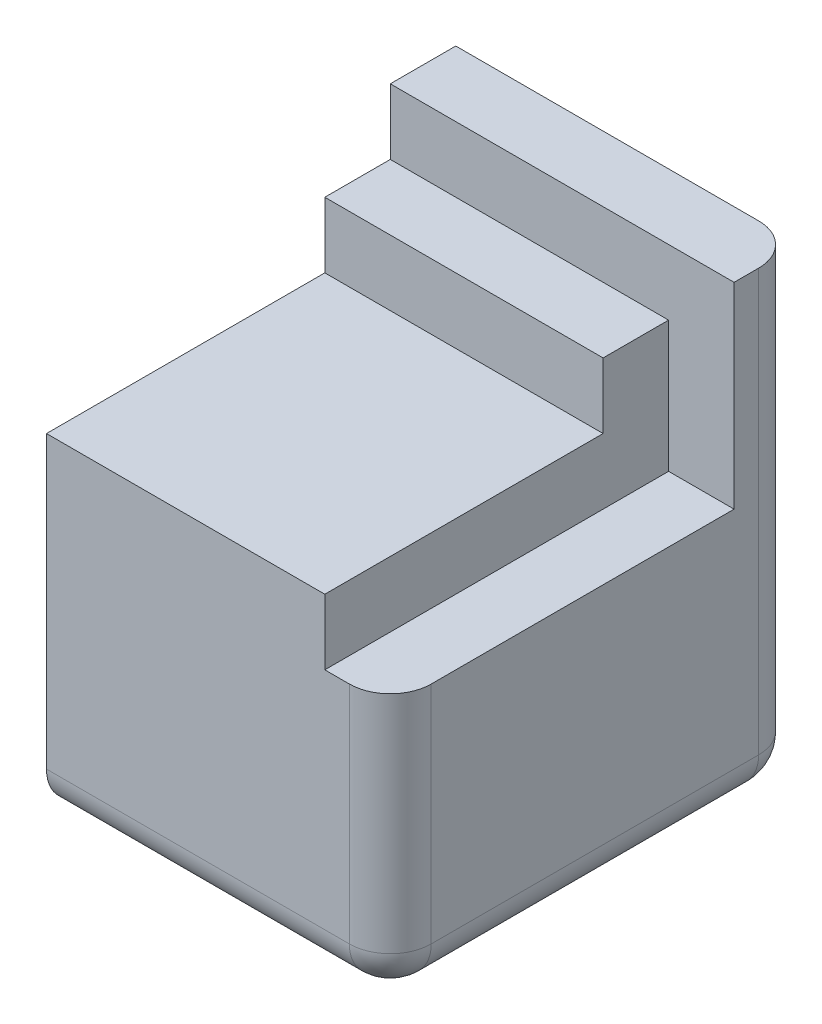
ISO-10303-21;
HEADER;
FILE_DESCRIPTION(('STEP AP214'),'2;1');
FILE_NAME('part.step','',(''),(''),'','','');
FILE_SCHEMA(('AUTOMOTIVE_DESIGN { 1 0 10303 214 1 1 1 1 }'));
ENDSEC;
DATA;
#1=APPLICATION_CONTEXT('core data for automotive mechanical design processes');
#2=APPLICATION_PROTOCOL_DEFINITION('international standard','automotive_design',2000,#1);
#3=PRODUCT_CONTEXT('',#1,'mechanical');
#4=PRODUCT('Part','Part','',(#3));
#5=PRODUCT_RELATED_PRODUCT_CATEGORY('part','',(#4));
#6=PRODUCT_DEFINITION_FORMATION('','',#4);
#7=PRODUCT_DEFINITION_CONTEXT('part definition',#1,'design');
#8=PRODUCT_DEFINITION('design','',#6,#7);
#9=PRODUCT_DEFINITION_SHAPE('','',#8);
#10=(LENGTH_UNIT() NAMED_UNIT(*) SI_UNIT(.MILLI.,.METRE.));
#11=(NAMED_UNIT(*) PLANE_ANGLE_UNIT() SI_UNIT($,.RADIAN.));
#12=(NAMED_UNIT(*) SI_UNIT($,.STERADIAN.) SOLID_ANGLE_UNIT());
#13=UNCERTAINTY_MEASURE_WITH_UNIT(LENGTH_MEASURE(1.E-05),#10,'distance_accuracy_value','');
#14=(GEOMETRIC_REPRESENTATION_CONTEXT(3) GLOBAL_UNCERTAINTY_ASSIGNED_CONTEXT((#13)) GLOBAL_UNIT_ASSIGNED_CONTEXT((#10,
#11,#12)) REPRESENTATION_CONTEXT('',''));
#15=CARTESIAN_POINT('',(0.,0.,0.));
#16=DIRECTION('',(0.,0.,1.));
#17=DIRECTION('',(1.,0.,0.));
#18=AXIS2_PLACEMENT_3D('',#15,#16,#17);
#19=CARTESIAN_POINT('',(-7.09999999999998,11.3,-3.4));
#20=DIRECTION('',(0.,0.,-1.));
#21=DIRECTION('',(-1.,0.,0.));
#22=AXIS2_PLACEMENT_3D('',#19,#20,#21);
#23=PLANE('',#22);
#24=DIRECTION('',(-1.,0.,0.));
#25=VECTOR('',#24,1.);
#26=CARTESIAN_POINT('',(2.60000000000002,9.7,-3.4));
#27=LINE('',#26,#25);
#28=CARTESIAN_POINT('',(2.60000000000002,9.7,-3.4));
#29=VERTEX_POINT('',#28);
#30=CARTESIAN_POINT('',(-4.19999999999998,9.7,-3.4));
#31=VERTEX_POINT('',#30);
#32=EDGE_CURVE('E163',#29,#31,#27,.T.);
#33=ORIENTED_EDGE('',*,*,#32,.F.);
#34=DIRECTION('',(0.,1.,0.));
#35=VECTOR('',#34,1.);
#36=CARTESIAN_POINT('',(2.60000000000002,6.5,-3.4));
#37=LINE('',#36,#35);
#38=CARTESIAN_POINT('',(2.60000000000002,6.5,-3.4));
#39=VERTEX_POINT('',#38);
#40=EDGE_CURVE('E190',#39,#29,#37,.T.);
#41=ORIENTED_EDGE('',*,*,#40,.F.);
#42=DIRECTION('',(1.,0.,0.));
#43=VECTOR('',#42,1.);
#44=CARTESIAN_POINT('',(2.60000000000002,6.5,-3.4));
#45=LINE('',#44,#43);
#46=CARTESIAN_POINT('',(4.20000000000002,6.5,-3.4));
#47=VERTEX_POINT('',#46);
#48=EDGE_CURVE('E194',#39,#47,#45,.T.);
#49=ORIENTED_EDGE('',*,*,#48,.T.);
#50=DIRECTION('',(0.,1.,0.));
#51=VECTOR('',#50,1.);
#52=CARTESIAN_POINT('',(4.20000000000002,11.3,-3.4));
#53=LINE('',#52,#51);
#54=CARTESIAN_POINT('',(4.20000000000002,11.3,-3.4));
#55=VERTEX_POINT('',#54);
#56=EDGE_CURVE('E197',#47,#55,#53,.T.);
#57=ORIENTED_EDGE('',*,*,#56,.T.);
#58=DIRECTION('',(1.,0.,0.));
#59=VECTOR('',#58,1.);
#60=CARTESIAN_POINT('',(0.,11.3,-3.4));
#61=LINE('',#60,#59);
#62=CARTESIAN_POINT('',(-4.19999999999999,11.3,-3.4));
#63=VERTEX_POINT('',#62);
#64=EDGE_CURVE('E220',#63,#55,#61,.T.);
#65=ORIENTED_EDGE('',*,*,#64,.F.);
#66=DIRECTION('',(0.,1.,0.));
#67=VECTOR('',#66,1.);
#68=CARTESIAN_POINT('',(-4.19999999999999,11.3,-3.4));
#69=LINE('',#68,#67);
#70=EDGE_CURVE('E201',#31,#63,#69,.T.);
#71=ORIENTED_EDGE('',*,*,#70,.F.);
#72=EDGE_LOOP('',(#33,#41,#49,#57,#65,#71));
#73=FACE_BOUND('',#72,.T.);
#74=ADVANCED_FACE('F37',(#73),#23,.F.);
#75=CARTESIAN_POINT('',(4.20000000000002,11.3,5.));
#76=DIRECTION('',(-1.,0.,0.));
#77=DIRECTION('',(0.,0.,1.));
#78=AXIS2_PLACEMENT_3D('',#75,#76,#77);
#79=PLANE('',#78);
#80=DIRECTION('',(0.,0.,-1.));
#81=VECTOR('',#80,1.);
#82=CARTESIAN_POINT('',(4.20000000000002,6.5,5.));
#83=LINE('',#82,#81);
#84=CARTESIAN_POINT('',(4.20000000000002,6.5,4.));
#85=VERTEX_POINT('',#84);
#86=EDGE_CURVE('E184',#85,#47,#83,.T.);
#87=ORIENTED_EDGE('',*,*,#86,.F.);
#88=DIRECTION('',(0.,-1.,0.));
#89=VECTOR('',#88,1.);
#90=CARTESIAN_POINT('',(4.20000000000002,11.3,4.));
#91=LINE('',#90,#89);
#92=CARTESIAN_POINT('',(4.20000000000002,1.,4.));
#93=VERTEX_POINT('',#92);
#94=EDGE_CURVE('E54',#85,#93,#91,.T.);
#95=ORIENTED_EDGE('',*,*,#94,.T.);
#96=DIRECTION('',(0.,0.,-1.));
#97=VECTOR('',#96,1.);
#98=CARTESIAN_POINT('',(4.20000000000002,1.,-5.));
#99=LINE('',#98,#97);
#100=CARTESIAN_POINT('',(4.20000000000002,1.,-4.));
#101=VERTEX_POINT('',#100);
#102=EDGE_CURVE('E59',#93,#101,#99,.T.);
#103=ORIENTED_EDGE('',*,*,#102,.T.);
#104=DIRECTION('',(0.,-1.,0.));
#105=VECTOR('',#104,1.);
#106=CARTESIAN_POINT('',(4.20000000000002,11.3,-4.));
#107=LINE('',#106,#105);
#108=CARTESIAN_POINT('',(4.20000000000002,11.3,-4.));
#109=VERTEX_POINT('',#108);
#110=EDGE_CURVE('E242',#101,#109,#107,.F.);
#111=ORIENTED_EDGE('',*,*,#110,.T.);
#112=DIRECTION('',(0.,0.,-1.));
#113=VECTOR('',#112,1.);
#114=CARTESIAN_POINT('',(4.20000000000002,11.3,5.));
#115=LINE('',#114,#113);
#116=EDGE_CURVE('E204',#55,#109,#115,.T.);
#117=ORIENTED_EDGE('',*,*,#116,.F.);
#118=ORIENTED_EDGE('',*,*,#56,.F.);
#119=EDGE_LOOP('',(#87,#95,#103,#111,#117,#118));
#120=FACE_BOUND('',#119,.T.);
#121=ADVANCED_FACE('F278',(#120),#79,.F.);
#122=CARTESIAN_POINT('',(-4.19999999999999,11.3,-5.));
#123=DIRECTION('',(0.,0.,1.));
#124=DIRECTION('',(1.,0.,0.));
#125=AXIS2_PLACEMENT_3D('',#122,#123,#124);
#126=PLANE('',#125);
#127=DIRECTION('',(0.,-1.,0.));
#128=VECTOR('',#127,1.);
#129=CARTESIAN_POINT('',(3.20000000000002,11.3,-5.));
#130=LINE('',#129,#128);
#131=CARTESIAN_POINT('',(3.20000000000002,11.3,-5.));
#132=VERTEX_POINT('',#131);
#133=CARTESIAN_POINT('',(3.20000000000002,1.,-5.));
#134=VERTEX_POINT('',#133);
#135=EDGE_CURVE('E223',#132,#134,#130,.T.);
#136=ORIENTED_EDGE('',*,*,#135,.T.);
#137=DIRECTION('',(-1.,0.,0.));
#138=VECTOR('',#137,1.);
#139=CARTESIAN_POINT('',(-4.19999999999999,1.,-5.));
#140=LINE('',#139,#138);
#141=CARTESIAN_POINT('',(-4.19999999999999,1.,-5.));
#142=VERTEX_POINT('',#141);
#143=EDGE_CURVE('E225',#134,#142,#140,.T.);
#144=ORIENTED_EDGE('',*,*,#143,.T.);
#145=DIRECTION('',(0.,-1.,0.));
#146=VECTOR('',#145,1.);
#147=CARTESIAN_POINT('',(-4.19999999999999,11.3,-5.));
#148=LINE('',#147,#146);
#149=CARTESIAN_POINT('',(-4.19999999999999,11.3,-5.));
#150=VERTEX_POINT('',#149);
#151=EDGE_CURVE('E217',#150,#142,#148,.T.);
#152=ORIENTED_EDGE('',*,*,#151,.F.);
#153=DIRECTION('',(-1.,0.,0.));
#154=VECTOR('',#153,1.);
#155=CARTESIAN_POINT('',(-4.19999999999999,11.3,-5.));
#156=LINE('',#155,#154);
#157=EDGE_CURVE('E207',#132,#150,#156,.T.);
#158=ORIENTED_EDGE('',*,*,#157,.F.);
#159=EDGE_LOOP('',(#136,#144,#152,#158));
#160=FACE_BOUND('',#159,.T.);
#161=ADVANCED_FACE('F319',(#160),#126,.F.);
#162=CARTESIAN_POINT('',(-4.19999999999999,11.3,5.));
#163=DIRECTION('',(1.,0.,0.));
#164=DIRECTION('',(0.,0.,-1.));
#165=AXIS2_PLACEMENT_3D('',#162,#163,#164);
#166=PLANE('',#165);
#167=CARTESIAN_POINT('',(-4.19999999999999,5.,0.));
#168=DIRECTION('',(-1.,0.,0.));
#169=DIRECTION('',(0.,0.,1.));
#170=AXIS2_PLACEMENT_3D('',#167,#168,#169);
#171=CIRCLE('',#170,1.25);
#172=CARTESIAN_POINT('',(-4.19999999999999,5.,1.25));
#173=VERTEX_POINT('',#172);
#174=EDGE_CURVE('E151',#173,#173,#171,.T.);
#175=ORIENTED_EDGE('',*,*,#174,.F.);
#176=EDGE_LOOP('',(#175));
#177=FACE_BOUND('',#176,.T.);
#178=ORIENTED_EDGE('',*,*,#151,.T.);
#179=CARTESIAN_POINT('',(-4.19999999999999,1.,-4.));
#180=DIRECTION('',(1.,0.,0.));
#181=DIRECTION('',(0.,0.,-1.));
#182=AXIS2_PLACEMENT_3D('',#179,#180,#181);
#183=CIRCLE('',#182,1.);
#184=CARTESIAN_POINT('',(-4.19999999999999,0.,-4.));
#185=VERTEX_POINT('',#184);
#186=EDGE_CURVE('E230',#142,#185,#183,.F.);
#187=ORIENTED_EDGE('',*,*,#186,.T.);
#188=DIRECTION('',(0.,0.,1.));
#189=VECTOR('',#188,1.);
#190=CARTESIAN_POINT('',(-4.19999999999999,0.,5.));
#191=LINE('',#190,#189);
#192=CARTESIAN_POINT('',(-4.19999999999999,0.,4.));
#193=VERTEX_POINT('',#192);
#194=EDGE_CURVE('E203',#185,#193,#191,.T.);
#195=ORIENTED_EDGE('',*,*,#194,.T.);
#196=CARTESIAN_POINT('',(-4.19999999999999,1.,4.));
#197=DIRECTION('',(1.,0.,0.));
#198=DIRECTION('',(0.,0.,-1.));
#199=AXIS2_PLACEMENT_3D('',#196,#197,#198);
#200=CIRCLE('',#199,1.);
#201=CARTESIAN_POINT('',(-4.19999999999999,1.,5.));
#202=VERTEX_POINT('',#201);
#203=EDGE_CURVE('E228',#193,#202,#200,.F.);
#204=ORIENTED_EDGE('',*,*,#203,.T.);
#205=DIRECTION('',(0.,-1.,0.));
#206=VECTOR('',#205,1.);
#207=CARTESIAN_POINT('',(-4.19999999999999,11.3,5.));
#208=LINE('',#207,#206);
#209=CARTESIAN_POINT('',(-4.19999999999998,8.1,5.));
#210=VERTEX_POINT('',#209);
#211=EDGE_CURVE('E212',#210,#202,#208,.T.);
#212=ORIENTED_EDGE('',*,*,#211,.F.);
#213=DIRECTION('',(0.,0.,-1.));
#214=VECTOR('',#213,1.);
#215=CARTESIAN_POINT('',(-4.19999999999998,8.1,-3.4));
#216=LINE('',#215,#214);
#217=CARTESIAN_POINT('',(-4.19999999999998,8.1,-1.8));
#218=VERTEX_POINT('',#217);
#219=EDGE_CURVE('E177',#210,#218,#216,.T.);
#220=ORIENTED_EDGE('',*,*,#219,.T.);
#221=DIRECTION('',(0.,-1.,0.));
#222=VECTOR('',#221,1.);
#223=CARTESIAN_POINT('',(-4.19999999999999,8.1,-1.8));
#224=LINE('',#223,#222);
#225=CARTESIAN_POINT('',(-4.19999999999998,9.7,-1.8));
#226=VERTEX_POINT('',#225);
#227=EDGE_CURVE('E165',#226,#218,#224,.T.);
#228=ORIENTED_EDGE('',*,*,#227,.F.);
#229=DIRECTION('',(0.,0.,-1.));
#230=VECTOR('',#229,1.);
#231=CARTESIAN_POINT('',(-4.19999999999998,9.7,-1.8));
#232=LINE('',#231,#230);
#233=EDGE_CURVE('E169',#226,#31,#232,.T.);
#234=ORIENTED_EDGE('',*,*,#233,.T.);
#235=ORIENTED_EDGE('',*,*,#70,.T.);
#236=DIRECTION('',(0.,0.,1.));
#237=VECTOR('',#236,1.);
#238=CARTESIAN_POINT('',(-4.19999999999999,11.3,5.));
#239=LINE('',#238,#237);
#240=EDGE_CURVE('E209',#150,#63,#239,.T.);
#241=ORIENTED_EDGE('',*,*,#240,.F.);
#242=EDGE_LOOP('',(#178,#187,#195,#204,#212,#220,#228,#234,#235,#241));
#243=FACE_BOUND('',#242,.T.);
#244=ADVANCED_FACE('F309',(#177,#243),#166,.F.);
#245=CARTESIAN_POINT('',(-4.19999999999999,11.3,5.));
#246=DIRECTION('',(0.,0.,-1.));
#247=DIRECTION('',(-1.,0.,0.));
#248=AXIS2_PLACEMENT_3D('',#245,#246,#247);
#249=PLANE('',#248);
#250=ORIENTED_EDGE('',*,*,#211,.T.);
#251=DIRECTION('',(1.,0.,0.));
#252=VECTOR('',#251,1.);
#253=CARTESIAN_POINT('',(4.20000000000002,1.,5.));
#254=LINE('',#253,#252);
#255=CARTESIAN_POINT('',(3.20000000000002,1.,5.));
#256=VERTEX_POINT('',#255);
#257=EDGE_CURVE('E240',#202,#256,#254,.T.);
#258=ORIENTED_EDGE('',*,*,#257,.T.);
#259=DIRECTION('',(0.,-1.,0.));
#260=VECTOR('',#259,1.);
#261=CARTESIAN_POINT('',(3.20000000000002,11.3,5.));
#262=LINE('',#261,#260);
#263=CARTESIAN_POINT('',(3.20000000000002,6.5,5.));
#264=VERTEX_POINT('',#263);
#265=EDGE_CURVE('E238',#256,#264,#262,.F.);
#266=ORIENTED_EDGE('',*,*,#265,.T.);
#267=DIRECTION('',(1.,0.,0.));
#268=VECTOR('',#267,1.);
#269=CARTESIAN_POINT('',(2.60000000000002,6.5,5.));
#270=LINE('',#269,#268);
#271=CARTESIAN_POINT('',(2.60000000000002,6.5,5.));
#272=VERTEX_POINT('',#271);
#273=EDGE_CURVE('E192',#272,#264,#270,.T.);
#274=ORIENTED_EDGE('',*,*,#273,.F.);
#275=DIRECTION('',(0.,-1.,0.));
#276=VECTOR('',#275,1.);
#277=CARTESIAN_POINT('',(2.60000000000002,6.5,5.));
#278=LINE('',#277,#276);
#279=CARTESIAN_POINT('',(2.60000000000002,8.1,5.));
#280=VERTEX_POINT('',#279);
#281=EDGE_CURVE('E185',#280,#272,#278,.T.);
#282=ORIENTED_EDGE('',*,*,#281,.F.);
#283=DIRECTION('',(1.,0.,0.));
#284=VECTOR('',#283,1.);
#285=CARTESIAN_POINT('',(-4.19999999999998,8.1,5.));
#286=LINE('',#285,#284);
#287=EDGE_CURVE('E180',#210,#280,#286,.T.);
#288=ORIENTED_EDGE('',*,*,#287,.F.);
#289=EDGE_LOOP('',(#250,#258,#266,#274,#282,#288));
#290=FACE_BOUND('',#289,.T.);
#291=ADVANCED_FACE('F296',(#290),#249,.F.);
#292=CARTESIAN_POINT('',(0.,11.3,0.));
#293=DIRECTION('',(0.,-1.,0.));
#294=DIRECTION('',(0.,0.,-1.));
#295=AXIS2_PLACEMENT_3D('',#292,#293,#294);
#296=PLANE('',#295);
#297=ORIENTED_EDGE('',*,*,#116,.T.);
#298=CARTESIAN_POINT('',(3.20000000000002,11.3,-4.));
#299=DIRECTION('',(0.,-1.,0.));
#300=DIRECTION('',(0.,0.,-1.));
#301=AXIS2_PLACEMENT_3D('',#298,#299,#300);
#302=CIRCLE('',#301,1.);
#303=EDGE_CURVE('E11',#109,#132,#302,.F.);
#304=ORIENTED_EDGE('',*,*,#303,.T.);
#305=ORIENTED_EDGE('',*,*,#157,.T.);
#306=ORIENTED_EDGE('',*,*,#240,.T.);
#307=ORIENTED_EDGE('',*,*,#64,.T.);
#308=EDGE_LOOP('',(#297,#304,#305,#306,#307));
#309=FACE_BOUND('',#308,.T.);
#310=ADVANCED_FACE('F281',(#309),#296,.F.);
#311=CARTESIAN_POINT('',(0.,0.,0.));
#312=DIRECTION('',(0.,-1.,0.));
#313=DIRECTION('',(0.,0.,-1.));
#314=AXIS2_PLACEMENT_3D('',#311,#312,#313);
#315=PLANE('',#314);
#316=ORIENTED_EDGE('',*,*,#194,.F.);
#317=DIRECTION('',(-1.,0.,0.));
#318=VECTOR('',#317,1.);
#319=CARTESIAN_POINT('',(4.20000000000002,0.,-4.));
#320=LINE('',#319,#318);
#321=CARTESIAN_POINT('',(3.20000000000002,0.,-4.));
#322=VERTEX_POINT('',#321);
#323=EDGE_CURVE('E236',#185,#322,#320,.F.);
#324=ORIENTED_EDGE('',*,*,#323,.T.);
#325=DIRECTION('',(0.,0.,-1.));
#326=VECTOR('',#325,1.);
#327=CARTESIAN_POINT('',(3.20000000000002,0.,5.));
#328=LINE('',#327,#326);
#329=CARTESIAN_POINT('',(3.20000000000002,0.,4.));
#330=VERTEX_POINT('',#329);
#331=EDGE_CURVE('E232',#322,#330,#328,.F.);
#332=ORIENTED_EDGE('',*,*,#331,.T.);
#333=DIRECTION('',(1.,0.,0.));
#334=VECTOR('',#333,1.);
#335=CARTESIAN_POINT('',(-4.19999999999999,0.,4.));
#336=LINE('',#335,#334);
#337=EDGE_CURVE('E234',#330,#193,#336,.F.);
#338=ORIENTED_EDGE('',*,*,#337,.T.);
#339=EDGE_LOOP('',(#316,#324,#332,#338));
#340=FACE_BOUND('',#339,.T.);
#341=ADVANCED_FACE('F314',(#340),#315,.T.);
#342=CARTESIAN_POINT('',(2.60000000000002,6.5,5.));
#343=DIRECTION('',(0.,-1.,0.));
#344=DIRECTION('',(0.,0.,-1.));
#345=AXIS2_PLACEMENT_3D('',#342,#343,#344);
#346=PLANE('',#345);
#347=ORIENTED_EDGE('',*,*,#273,.T.);
#348=CARTESIAN_POINT('',(3.20000000000002,6.5,4.));
#349=DIRECTION('',(0.,-1.,0.));
#350=DIRECTION('',(0.,0.,-1.));
#351=AXIS2_PLACEMENT_3D('',#348,#349,#350);
#352=CIRCLE('',#351,1.);
#353=EDGE_CURVE('E46',#264,#85,#352,.F.);
#354=ORIENTED_EDGE('',*,*,#353,.T.);
#355=ORIENTED_EDGE('',*,*,#86,.T.);
#356=ORIENTED_EDGE('',*,*,#48,.F.);
#357=DIRECTION('',(0.,0.,-1.));
#358=VECTOR('',#357,1.);
#359=CARTESIAN_POINT('',(2.60000000000002,6.5,5.));
#360=LINE('',#359,#358);
#361=EDGE_CURVE('E187',#272,#39,#360,.T.);
#362=ORIENTED_EDGE('',*,*,#361,.F.);
#363=EDGE_LOOP('',(#347,#354,#355,#356,#362));
#364=FACE_BOUND('',#363,.T.);
#365=ADVANCED_FACE('F299',(#364),#346,.F.);
#366=CARTESIAN_POINT('',(2.60000000000002,0.,0.));
#367=DIRECTION('',(-1.,0.,0.));
#368=DIRECTION('',(0.,0.,1.));
#369=AXIS2_PLACEMENT_3D('',#366,#367,#368);
#370=PLANE('',#369);
#371=ORIENTED_EDGE('',*,*,#40,.T.);
#372=DIRECTION('',(0.,0.,-1.));
#373=VECTOR('',#372,1.);
#374=CARTESIAN_POINT('',(2.60000000000002,9.7,-1.8));
#375=LINE('',#374,#373);
#376=CARTESIAN_POINT('',(2.60000000000002,9.7,-1.8));
#377=VERTEX_POINT('',#376);
#378=EDGE_CURVE('E173',#377,#29,#375,.T.);
#379=ORIENTED_EDGE('',*,*,#378,.F.);
#380=DIRECTION('',(0.,1.,0.));
#381=VECTOR('',#380,1.);
#382=CARTESIAN_POINT('',(2.60000000000002,8.1,-1.8));
#383=LINE('',#382,#381);
#384=CARTESIAN_POINT('',(2.60000000000002,8.1,-1.8));
#385=VERTEX_POINT('',#384);
#386=EDGE_CURVE('E159',#385,#377,#383,.T.);
#387=ORIENTED_EDGE('',*,*,#386,.F.);
#388=DIRECTION('',(0.,0.,-1.));
#389=VECTOR('',#388,1.);
#390=CARTESIAN_POINT('',(2.60000000000002,8.1,-3.4));
#391=LINE('',#390,#389);
#392=EDGE_CURVE('E176',#280,#385,#391,.T.);
#393=ORIENTED_EDGE('',*,*,#392,.F.);
#394=ORIENTED_EDGE('',*,*,#281,.T.);
#395=ORIENTED_EDGE('',*,*,#361,.T.);
#396=EDGE_LOOP('',(#371,#379,#387,#393,#394,#395));
#397=FACE_BOUND('',#396,.T.);
#398=ADVANCED_FACE('F301',(#397),#370,.F.);
#399=CARTESIAN_POINT('',(-4.19999999999998,8.1,-3.4));
#400=DIRECTION('',(0.,-1.,0.));
#401=DIRECTION('',(0.,0.,-1.));
#402=AXIS2_PLACEMENT_3D('',#399,#400,#401);
#403=PLANE('',#402);
#404=ORIENTED_EDGE('',*,*,#392,.T.);
#405=DIRECTION('',(1.,0.,0.));
#406=VECTOR('',#405,1.);
#407=CARTESIAN_POINT('',(2.60000000000002,8.1,-1.8));
#408=LINE('',#407,#406);
#409=EDGE_CURVE('E167',#218,#385,#408,.T.);
#410=ORIENTED_EDGE('',*,*,#409,.F.);
#411=ORIENTED_EDGE('',*,*,#219,.F.);
#412=ORIENTED_EDGE('',*,*,#287,.T.);
#413=EDGE_LOOP('',(#404,#410,#411,#412));
#414=FACE_BOUND('',#413,.T.);
#415=ADVANCED_FACE('F325',(#414),#403,.F.);
#416=CARTESIAN_POINT('',(2.60000000000002,9.7,-1.8));
#417=DIRECTION('',(0.,-1.,0.));
#418=DIRECTION('',(0.,0.,-1.));
#419=AXIS2_PLACEMENT_3D('',#416,#417,#418);
#420=PLANE('',#419);
#421=ORIENTED_EDGE('',*,*,#32,.T.);
#422=ORIENTED_EDGE('',*,*,#233,.F.);
#423=DIRECTION('',(-1.,0.,0.));
#424=VECTOR('',#423,1.);
#425=CARTESIAN_POINT('',(2.60000000000002,9.7,-1.8));
#426=LINE('',#425,#424);
#427=EDGE_CURVE('E162',#377,#226,#426,.T.);
#428=ORIENTED_EDGE('',*,*,#427,.F.);
#429=ORIENTED_EDGE('',*,*,#378,.T.);
#430=EDGE_LOOP('',(#421,#422,#428,#429));
#431=FACE_BOUND('',#430,.T.);
#432=ADVANCED_FACE('F322',(#431),#420,.F.);
#433=CARTESIAN_POINT('',(0.,0.,-1.8));
#434=DIRECTION('',(0.,0.,1.));
#435=DIRECTION('',(1.,0.,0.));
#436=AXIS2_PLACEMENT_3D('',#433,#434,#435);
#437=PLANE('',#436);
#438=ORIENTED_EDGE('',*,*,#386,.T.);
#439=ORIENTED_EDGE('',*,*,#427,.T.);
#440=ORIENTED_EDGE('',*,*,#227,.T.);
#441=ORIENTED_EDGE('',*,*,#409,.T.);
#442=EDGE_LOOP('',(#438,#439,#440,#441));
#443=FACE_BOUND('',#442,.T.);
#444=ADVANCED_FACE('F326',(#443),#437,.T.);
#445=CARTESIAN_POINT('',(-4.19999999999999,1.,4.));
#446=DIRECTION('',(-1.,0.,0.));
#447=DIRECTION('',(0.,0.,1.));
#448=AXIS2_PLACEMENT_3D('',#445,#446,#447);
#449=CYLINDRICAL_SURFACE('',#448,1.);
#450=ORIENTED_EDGE('',*,*,#203,.F.);
#451=ORIENTED_EDGE('',*,*,#337,.F.);
#452=CARTESIAN_POINT('',(3.20000000000002,1.,4.));
#453=DIRECTION('',(1.,0.,0.));
#454=DIRECTION('',(0.,0.,-1.));
#455=AXIS2_PLACEMENT_3D('',#452,#453,#454);
#456=CIRCLE('',#455,1.);
#457=EDGE_CURVE('E41',#256,#330,#456,.T.);
#458=ORIENTED_EDGE('',*,*,#457,.F.);
#459=ORIENTED_EDGE('',*,*,#257,.F.);
#460=EDGE_LOOP('',(#450,#451,#458,#459));
#461=FACE_BOUND('',#460,.T.);
#462=ADVANCED_FACE('F39',(#461),#449,.T.);
#463=CARTESIAN_POINT('',(3.20000000000002,11.3,4.));
#464=DIRECTION('',(0.,-1.,0.));
#465=DIRECTION('',(0.,0.,-1.));
#466=AXIS2_PLACEMENT_3D('',#463,#464,#465);
#467=CYLINDRICAL_SURFACE('',#466,1.);
#468=ORIENTED_EDGE('',*,*,#353,.F.);
#469=ORIENTED_EDGE('',*,*,#265,.F.);
#470=CARTESIAN_POINT('',(3.20000000000002,1.,4.));
#471=DIRECTION('',(0.,-1.,0.));
#472=DIRECTION('',(0.,0.,-1.));
#473=AXIS2_PLACEMENT_3D('',#470,#471,#472);
#474=CIRCLE('',#473,1.);
#475=EDGE_CURVE('E254',#93,#256,#474,.T.);
#476=ORIENTED_EDGE('',*,*,#475,.F.);
#477=ORIENTED_EDGE('',*,*,#94,.F.);
#478=EDGE_LOOP('',(#468,#469,#476,#477));
#479=FACE_BOUND('',#478,.T.);
#480=ADVANCED_FACE('F292',(#479),#467,.T.);
#481=CARTESIAN_POINT('',(3.20000000000002,1.,4.));
#482=DIRECTION('',(0.,0.,1.));
#483=DIRECTION('',(1.,0.,0.));
#484=AXIS2_PLACEMENT_3D('',#481,#482,#483);
#485=SPHERICAL_SURFACE('',#484,1.);
#486=ORIENTED_EDGE('',*,*,#475,.T.);
#487=ORIENTED_EDGE('',*,*,#457,.T.);
#488=CARTESIAN_POINT('',(3.20000000000002,1.,4.));
#489=DIRECTION('',(0.,0.,1.));
#490=DIRECTION('',(1.,0.,0.));
#491=AXIS2_PLACEMENT_3D('',#488,#489,#490);
#492=CIRCLE('',#491,1.);
#493=EDGE_CURVE('E252',#93,#330,#492,.F.);
#494=ORIENTED_EDGE('',*,*,#493,.F.);
#495=EDGE_LOOP('',(#486,#487,#494));
#496=FACE_BOUND('',#495,.T.);
#497=ADVANCED_FACE('F260',(#496),#485,.T.);
#498=CARTESIAN_POINT('',(3.20000000000002,1.,5.));
#499=DIRECTION('',(0.,0.,1.));
#500=DIRECTION('',(1.,0.,0.));
#501=AXIS2_PLACEMENT_3D('',#498,#499,#500);
#502=CYLINDRICAL_SURFACE('',#501,1.);
#503=ORIENTED_EDGE('',*,*,#493,.T.);
#504=ORIENTED_EDGE('',*,*,#331,.F.);
#505=CARTESIAN_POINT('',(3.20000000000002,1.,-4.));
#506=DIRECTION('',(0.,0.,-1.));
#507=DIRECTION('',(-1.,0.,0.));
#508=AXIS2_PLACEMENT_3D('',#505,#506,#507);
#509=CIRCLE('',#508,1.);
#510=EDGE_CURVE('E249',#101,#322,#509,.T.);
#511=ORIENTED_EDGE('',*,*,#510,.F.);
#512=ORIENTED_EDGE('',*,*,#102,.F.);
#513=EDGE_LOOP('',(#503,#504,#511,#512));
#514=FACE_BOUND('',#513,.T.);
#515=ADVANCED_FACE('F266',(#514),#502,.T.);
#516=CARTESIAN_POINT('',(3.20000000000002,11.3,-4.));
#517=DIRECTION('',(0.,-1.,0.));
#518=DIRECTION('',(0.,0.,-1.));
#519=AXIS2_PLACEMENT_3D('',#516,#517,#518);
#520=CYLINDRICAL_SURFACE('',#519,1.);
#521=ORIENTED_EDGE('',*,*,#303,.F.);
#522=ORIENTED_EDGE('',*,*,#110,.F.);
#523=CARTESIAN_POINT('',(3.20000000000002,1.,-4.));
#524=DIRECTION('',(0.,-1.,0.));
#525=DIRECTION('',(0.,0.,-1.));
#526=AXIS2_PLACEMENT_3D('',#523,#524,#525);
#527=CIRCLE('',#526,1.);
#528=EDGE_CURVE('E154',#134,#101,#527,.T.);
#529=ORIENTED_EDGE('',*,*,#528,.F.);
#530=ORIENTED_EDGE('',*,*,#135,.F.);
#531=EDGE_LOOP('',(#521,#522,#529,#530));
#532=FACE_BOUND('',#531,.T.);
#533=ADVANCED_FACE('F276',(#532),#520,.T.);
#534=CARTESIAN_POINT('',(3.20000000000002,1.,-4.));
#535=DIRECTION('',(0.,0.,1.));
#536=DIRECTION('',(1.,0.,0.));
#537=AXIS2_PLACEMENT_3D('',#534,#535,#536);
#538=SPHERICAL_SURFACE('',#537,1.);
#539=ORIENTED_EDGE('',*,*,#528,.T.);
#540=ORIENTED_EDGE('',*,*,#510,.T.);
#541=CARTESIAN_POINT('',(3.20000000000002,1.,-4.));
#542=DIRECTION('',(1.,0.,0.));
#543=DIRECTION('',(0.,0.,-1.));
#544=AXIS2_PLACEMENT_3D('',#541,#542,#543);
#545=CIRCLE('',#544,1.);
#546=EDGE_CURVE('E150',#134,#322,#545,.F.);
#547=ORIENTED_EDGE('',*,*,#546,.F.);
#548=EDGE_LOOP('',(#539,#540,#547));
#549=FACE_BOUND('',#548,.T.);
#550=ADVANCED_FACE('F271',(#549),#538,.T.);
#551=CARTESIAN_POINT('',(-4.19999999999999,1.,-4.));
#552=DIRECTION('',(1.,0.,0.));
#553=DIRECTION('',(0.,0.,-1.));
#554=AXIS2_PLACEMENT_3D('',#551,#552,#553);
#555=CYLINDRICAL_SURFACE('',#554,1.);
#556=ORIENTED_EDGE('',*,*,#546,.T.);
#557=ORIENTED_EDGE('',*,*,#323,.F.);
#558=ORIENTED_EDGE('',*,*,#186,.F.);
#559=ORIENTED_EDGE('',*,*,#143,.F.);
#560=EDGE_LOOP('',(#556,#557,#558,#559));
#561=FACE_BOUND('',#560,.T.);
#562=ADVANCED_FACE('F144',(#561),#555,.T.);
#563=CARTESIAN_POINT('',(2.30000000000001,5.,0.));
#564=DIRECTION('',(-1.,0.,0.));
#565=DIRECTION('',(0.,0.,1.));
#566=AXIS2_PLACEMENT_3D('',#563,#564,#565);
#567=CONICAL_SURFACE('',#566,1.25,1.02974425867665);
#568=CARTESIAN_POINT('',(3.05107577378446,5.,0.));
#569=VERTEX_POINT('',#568);
#570=VERTEX_LOOP('',#569);
#571=FACE_BOUND('',#570,.T.);
#572=CARTESIAN_POINT('',(2.30000000000001,5.,0.));
#573=DIRECTION('',(-1.,0.,0.));
#574=DIRECTION('',(0.,0.,1.));
#575=AXIS2_PLACEMENT_3D('',#572,#573,#574);
#576=CIRCLE('',#575,1.25);
#577=CARTESIAN_POINT('',(2.30000000000001,5.,1.25));
#578=VERTEX_POINT('',#577);
#579=EDGE_CURVE('E148',#578,#578,#576,.T.);
#580=ORIENTED_EDGE('',*,*,#579,.T.);
#581=EDGE_LOOP('',(#580));
#582=FACE_BOUND('',#581,.T.);
#583=ADVANCED_FACE('F140',(#571,#582),#567,.F.);
#584=CARTESIAN_POINT('',(-4.19999999999999,5.,0.));
#585=DIRECTION('',(-1.,0.,0.));
#586=DIRECTION('',(0.,0.,1.));
#587=AXIS2_PLACEMENT_3D('',#584,#585,#586);
#588=CYLINDRICAL_SURFACE('',#587,1.25);
#589=ORIENTED_EDGE('',*,*,#579,.F.);
#590=EDGE_LOOP('',(#589));
#591=FACE_BOUND('',#590,.T.);
#592=ORIENTED_EDGE('',*,*,#174,.T.);
#593=EDGE_LOOP('',(#592));
#594=FACE_BOUND('',#593,.T.);
#595=ADVANCED_FACE('F143',(#591,#594),#588,.F.);
#596=CLOSED_SHELL('',(#74,#121,#161,#244,#291,#310,#341,#365,#398,#415,#432,#444,#462,#480,#497,
#515,#533,#550,#562,#583,#595));
#597=MANIFOLD_SOLID_BREP('B2',#596);
#598=ADVANCED_BREP_SHAPE_REPRESENTATION('',(#18,#597),#14);
#599=SHAPE_DEFINITION_REPRESENTATION(#9,#598);
ENDSEC;
END-ISO-10303-21;
